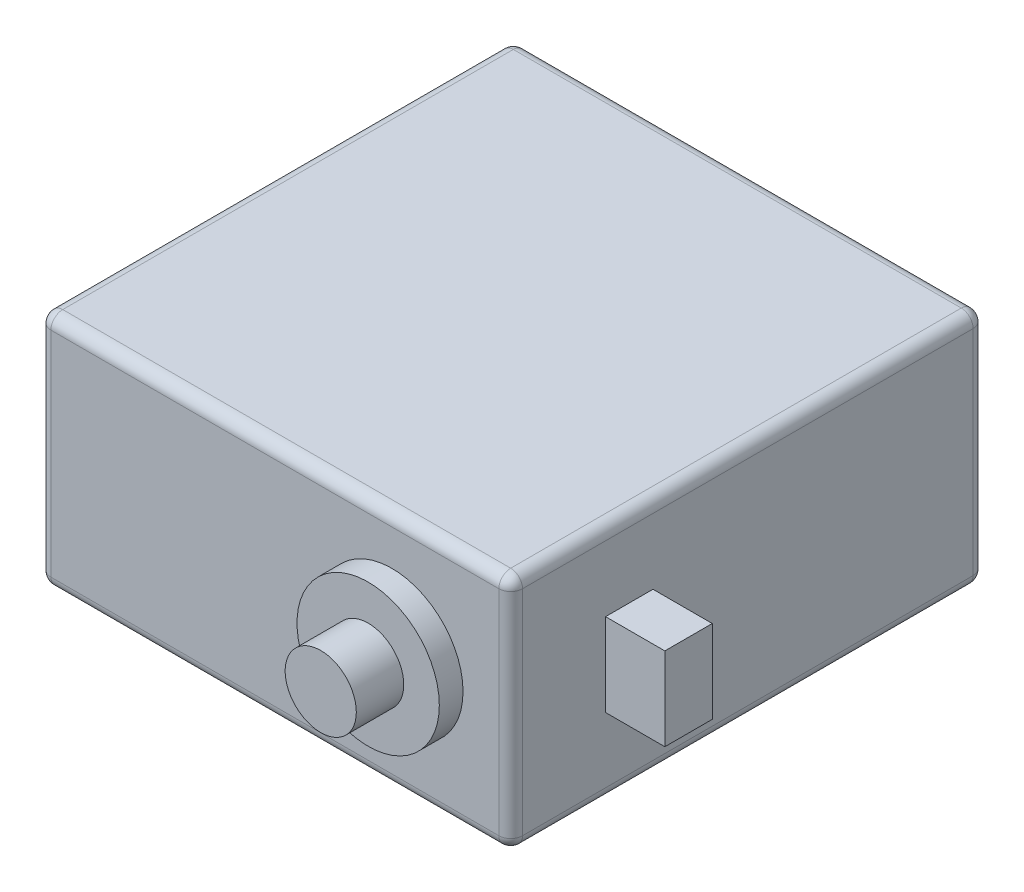
ISO-10303-21;
HEADER;
FILE_DESCRIPTION(('STEP AP214'),'2;1');
FILE_NAME('part.step','',(''),(''),'','','');
FILE_SCHEMA(('AUTOMOTIVE_DESIGN { 1 0 10303 214 1 1 1 1 }'));
ENDSEC;
DATA;
#1=APPLICATION_CONTEXT('core data for automotive mechanical design processes');
#2=APPLICATION_PROTOCOL_DEFINITION('international standard','automotive_design',2000,#1);
#3=PRODUCT_CONTEXT('',#1,'mechanical');
#4=PRODUCT('Part','Part','',(#3));
#5=PRODUCT_RELATED_PRODUCT_CATEGORY('part','',(#4));
#6=PRODUCT_DEFINITION_FORMATION('','',#4);
#7=PRODUCT_DEFINITION_CONTEXT('part definition',#1,'design');
#8=PRODUCT_DEFINITION('design','',#6,#7);
#9=PRODUCT_DEFINITION_SHAPE('','',#8);
#10=(LENGTH_UNIT() NAMED_UNIT(*) SI_UNIT(.MILLI.,.METRE.));
#11=(NAMED_UNIT(*) PLANE_ANGLE_UNIT() SI_UNIT($,.RADIAN.));
#12=(NAMED_UNIT(*) SI_UNIT($,.STERADIAN.) SOLID_ANGLE_UNIT());
#13=UNCERTAINTY_MEASURE_WITH_UNIT(LENGTH_MEASURE(1.E-05),#10,'distance_accuracy_value','');
#14=(GEOMETRIC_REPRESENTATION_CONTEXT(3) GLOBAL_UNCERTAINTY_ASSIGNED_CONTEXT((#13)) GLOBAL_UNIT_ASSIGNED_CONTEXT((#10,
#11,#12)) REPRESENTATION_CONTEXT('',''));
#15=CARTESIAN_POINT('',(0.,0.,0.));
#16=DIRECTION('',(0.,0.,1.));
#17=DIRECTION('',(1.,0.,0.));
#18=AXIS2_PLACEMENT_3D('',#15,#16,#17);
#19=CARTESIAN_POINT('',(19.89,20.04,20.));
#20=DIRECTION('',(-1.,0.,0.));
#21=DIRECTION('',(0.,0.,-1.));
#22=AXIS2_PLACEMENT_3D('',#19,#20,#21);
#23=PLANE('',#22);
#24=DIRECTION('',(0.,0.,1.));
#25=VECTOR('',#24,1.);
#26=CARTESIAN_POINT('',(19.89,19.04,20.));
#27=LINE('',#26,#25);
#28=CARTESIAN_POINT('',(19.89,19.04,19.));
#29=VERTEX_POINT('',#28);
#30=CARTESIAN_POINT('',(19.89,19.04,-19.));
#31=VERTEX_POINT('',#30);
#32=EDGE_CURVE('E50',#29,#31,#27,.F.);
#33=ORIENTED_EDGE('',*,*,#32,.F.);
#34=DIRECTION('',(0.,-1.,0.));
#35=VECTOR('',#34,1.);
#36=CARTESIAN_POINT('',(19.89,20.04,19.));
#37=LINE('',#36,#35);
#38=CARTESIAN_POINT('',(19.89,1.,19.));
#39=VERTEX_POINT('',#38);
#40=EDGE_CURVE('E270',#39,#29,#37,.F.);
#41=ORIENTED_EDGE('',*,*,#40,.F.);
#42=DIRECTION('',(0.,0.,1.));
#43=VECTOR('',#42,1.);
#44=CARTESIAN_POINT('',(19.89,1.,20.));
#45=LINE('',#44,#43);
#46=CARTESIAN_POINT('',(19.89,1.,-19.));
#47=VERTEX_POINT('',#46);
#48=EDGE_CURVE('E267',#47,#39,#45,.T.);
#49=ORIENTED_EDGE('',*,*,#48,.F.);
#50=DIRECTION('',(0.,-1.,0.));
#51=VECTOR('',#50,1.);
#52=CARTESIAN_POINT('',(19.89,20.04,-19.));
#53=LINE('',#52,#51);
#54=EDGE_CURVE('E11',#31,#47,#53,.T.);
#55=ORIENTED_EDGE('',*,*,#54,.F.);
#56=EDGE_LOOP('',(#33,#41,#49,#55));
#57=FACE_BOUND('',#56,.T.);
#58=DIRECTION('',(0.,-1.,0.));
#59=VECTOR('',#58,1.);
#60=CARTESIAN_POINT('',(19.89,13.5,8.));
#61=LINE('',#60,#59);
#62=CARTESIAN_POINT('',(19.89,13.5,8.));
#63=VERTEX_POINT('',#62);
#64=CARTESIAN_POINT('',(19.89,6.5,8.));
#65=VERTEX_POINT('',#64);
#66=EDGE_CURVE('E185',#63,#65,#61,.T.);
#67=ORIENTED_EDGE('',*,*,#66,.T.);
#68=DIRECTION('',(0.,0.,1.));
#69=VECTOR('',#68,1.);
#70=CARTESIAN_POINT('',(19.89,6.5,12.));
#71=LINE('',#70,#69);
#72=CARTESIAN_POINT('',(19.89,6.5,12.));
#73=VERTEX_POINT('',#72);
#74=EDGE_CURVE('E167',#65,#73,#71,.T.);
#75=ORIENTED_EDGE('',*,*,#74,.T.);
#76=DIRECTION('',(0.,1.,0.));
#77=VECTOR('',#76,1.);
#78=CARTESIAN_POINT('',(19.89,13.5,12.));
#79=LINE('',#78,#77);
#80=CARTESIAN_POINT('',(19.89,13.5,12.));
#81=VERTEX_POINT('',#80);
#82=EDGE_CURVE('E176',#73,#81,#79,.T.);
#83=ORIENTED_EDGE('',*,*,#82,.T.);
#84=DIRECTION('',(0.,0.,-1.));
#85=VECTOR('',#84,1.);
#86=CARTESIAN_POINT('',(19.89,13.5,12.));
#87=LINE('',#86,#85);
#88=EDGE_CURVE('E173',#81,#63,#87,.T.);
#89=ORIENTED_EDGE('',*,*,#88,.T.);
#90=EDGE_LOOP('',(#67,#75,#83,#89));
#91=FACE_BOUND('',#90,.T.);
#92=ADVANCED_FACE('F41',(#57,#91),#23,.F.);
#93=CARTESIAN_POINT('',(-19.89,20.04,20.));
#94=DIRECTION('',(1.,0.,0.));
#95=DIRECTION('',(0.,0.,1.));
#96=AXIS2_PLACEMENT_3D('',#93,#94,#95);
#97=PLANE('',#96);
#98=DIRECTION('',(0.,-1.,0.));
#99=VECTOR('',#98,1.);
#100=CARTESIAN_POINT('',(-19.89,20.04,-19.));
#101=LINE('',#100,#99);
#102=CARTESIAN_POINT('',(-19.89,1.,-19.));
#103=VERTEX_POINT('',#102);
#104=CARTESIAN_POINT('',(-19.89,19.04,-19.));
#105=VERTEX_POINT('',#104);
#106=EDGE_CURVE('E210',#103,#105,#101,.F.);
#107=ORIENTED_EDGE('',*,*,#106,.F.);
#108=DIRECTION('',(0.,0.,-1.));
#109=VECTOR('',#108,1.);
#110=CARTESIAN_POINT('',(-19.89,1.,-20.));
#111=LINE('',#110,#109);
#112=CARTESIAN_POINT('',(-19.89,1.,19.));
#113=VERTEX_POINT('',#112);
#114=EDGE_CURVE('E202',#113,#103,#111,.T.);
#115=ORIENTED_EDGE('',*,*,#114,.F.);
#116=DIRECTION('',(0.,-1.,0.));
#117=VECTOR('',#116,1.);
#118=CARTESIAN_POINT('',(-19.89,20.04,19.));
#119=LINE('',#118,#117);
#120=CARTESIAN_POINT('',(-19.89,19.04,19.));
#121=VERTEX_POINT('',#120);
#122=EDGE_CURVE('E213',#121,#113,#119,.T.);
#123=ORIENTED_EDGE('',*,*,#122,.F.);
#124=DIRECTION('',(0.,0.,-1.));
#125=VECTOR('',#124,1.);
#126=CARTESIAN_POINT('',(-19.89,19.04,20.));
#127=LINE('',#126,#125);
#128=EDGE_CURVE('E216',#105,#121,#127,.F.);
#129=ORIENTED_EDGE('',*,*,#128,.F.);
#130=EDGE_LOOP('',(#107,#115,#123,#129));
#131=FACE_BOUND('',#130,.T.);
#132=ADVANCED_FACE('F383',(#131),#97,.F.);
#133=CARTESIAN_POINT('',(19.89,20.04,-20.));
#134=DIRECTION('',(0.,0.,1.));
#135=DIRECTION('',(-1.,0.,0.));
#136=AXIS2_PLACEMENT_3D('',#133,#134,#135);
#137=PLANE('',#136);
#138=DIRECTION('',(1.,0.,0.));
#139=VECTOR('',#138,1.);
#140=CARTESIAN_POINT('',(19.89,19.04,-20.));
#141=LINE('',#140,#139);
#142=CARTESIAN_POINT('',(18.89,19.04,-20.));
#143=VERTEX_POINT('',#142);
#144=CARTESIAN_POINT('',(-18.89,19.04,-20.));
#145=VERTEX_POINT('',#144);
#146=EDGE_CURVE('E237',#143,#145,#141,.F.);
#147=ORIENTED_EDGE('',*,*,#146,.F.);
#148=DIRECTION('',(0.,-1.,0.));
#149=VECTOR('',#148,1.);
#150=CARTESIAN_POINT('',(18.89,20.04,-20.));
#151=LINE('',#150,#149);
#152=CARTESIAN_POINT('',(18.89,1.,-20.));
#153=VERTEX_POINT('',#152);
#154=EDGE_CURVE('E231',#153,#143,#151,.F.);
#155=ORIENTED_EDGE('',*,*,#154,.F.);
#156=DIRECTION('',(1.,0.,0.));
#157=VECTOR('',#156,1.);
#158=CARTESIAN_POINT('',(19.89,1.,-20.));
#159=LINE('',#158,#157);
#160=CARTESIAN_POINT('',(-18.89,1.,-20.));
#161=VERTEX_POINT('',#160);
#162=EDGE_CURVE('E234',#161,#153,#159,.T.);
#163=ORIENTED_EDGE('',*,*,#162,.F.);
#164=DIRECTION('',(0.,-1.,0.));
#165=VECTOR('',#164,1.);
#166=CARTESIAN_POINT('',(-18.89,20.04,-20.));
#167=LINE('',#166,#165);
#168=EDGE_CURVE('E240',#145,#161,#167,.T.);
#169=ORIENTED_EDGE('',*,*,#168,.F.);
#170=EDGE_LOOP('',(#147,#155,#163,#169));
#171=FACE_BOUND('',#170,.T.);
#172=CARTESIAN_POINT('',(9.87,10.02,-20.));
#173=DIRECTION('',(0.,0.,-1.));
#174=DIRECTION('',(-1.,0.,0.));
#175=AXIS2_PLACEMENT_3D('',#172,#173,#174);
#176=CIRCLE('',#175,6.);
#177=CARTESIAN_POINT('',(3.87,10.02,-20.));
#178=VERTEX_POINT('',#177);
#179=EDGE_CURVE('E203',#178,#178,#176,.F.);
#180=ORIENTED_EDGE('',*,*,#179,.T.);
#181=EDGE_LOOP('',(#180));
#182=FACE_BOUND('',#181,.T.);
#183=ADVANCED_FACE('F368',(#171,#182),#137,.F.);
#184=CARTESIAN_POINT('',(19.89,20.04,20.));
#185=DIRECTION('',(0.,0.,-1.));
#186=DIRECTION('',(1.,0.,0.));
#187=AXIS2_PLACEMENT_3D('',#184,#185,#186);
#188=PLANE('',#187);
#189=CARTESIAN_POINT('',(9.87,10.02,20.));
#190=DIRECTION('',(0.,0.,1.));
#191=DIRECTION('',(1.,0.,0.));
#192=AXIS2_PLACEMENT_3D('',#189,#190,#191);
#193=CIRCLE('',#192,6.);
#194=CARTESIAN_POINT('',(15.87,10.02,20.));
#195=VERTEX_POINT('',#194);
#196=EDGE_CURVE('E179',#195,#195,#193,.T.);
#197=ORIENTED_EDGE('',*,*,#196,.F.);
#198=EDGE_LOOP('',(#197));
#199=FACE_BOUND('',#198,.T.);
#200=DIRECTION('',(-1.,0.,0.));
#201=VECTOR('',#200,1.);
#202=CARTESIAN_POINT('',(-19.89,1.,20.));
#203=LINE('',#202,#201);
#204=CARTESIAN_POINT('',(18.89,1.,20.));
#205=VERTEX_POINT('',#204);
#206=CARTESIAN_POINT('',(-18.89,1.,20.));
#207=VERTEX_POINT('',#206);
#208=EDGE_CURVE('E222',#205,#207,#203,.T.);
#209=ORIENTED_EDGE('',*,*,#208,.F.);
#210=DIRECTION('',(0.,-1.,0.));
#211=VECTOR('',#210,1.);
#212=CARTESIAN_POINT('',(18.89,20.04,20.));
#213=LINE('',#212,#211);
#214=CARTESIAN_POINT('',(18.89,19.04,20.));
#215=VERTEX_POINT('',#214);
#216=EDGE_CURVE('E219',#215,#205,#213,.T.);
#217=ORIENTED_EDGE('',*,*,#216,.F.);
#218=DIRECTION('',(-1.,0.,0.));
#219=VECTOR('',#218,1.);
#220=CARTESIAN_POINT('',(19.89,19.04,20.));
#221=LINE('',#220,#219);
#222=CARTESIAN_POINT('',(-18.89,19.04,20.));
#223=VERTEX_POINT('',#222);
#224=EDGE_CURVE('E225',#223,#215,#221,.F.);
#225=ORIENTED_EDGE('',*,*,#224,.F.);
#226=DIRECTION('',(0.,-1.,0.));
#227=VECTOR('',#226,1.);
#228=CARTESIAN_POINT('',(-18.89,20.04,20.));
#229=LINE('',#228,#227);
#230=EDGE_CURVE('E228',#207,#223,#229,.F.);
#231=ORIENTED_EDGE('',*,*,#230,.F.);
#232=EDGE_LOOP('',(#209,#217,#225,#231));
#233=FACE_BOUND('',#232,.T.);
#234=ADVANCED_FACE('F392',(#199,#233),#188,.F.);
#235=CARTESIAN_POINT('',(0.,20.04,0.));
#236=DIRECTION('',(0.,-1.,0.));
#237=DIRECTION('',(0.,0.,1.));
#238=AXIS2_PLACEMENT_3D('',#235,#236,#237);
#239=PLANE('',#238);
#240=DIRECTION('',(-1.,0.,0.));
#241=VECTOR('',#240,1.);
#242=CARTESIAN_POINT('',(0.,20.04,19.));
#243=LINE('',#242,#241);
#244=CARTESIAN_POINT('',(18.89,20.04,19.));
#245=VERTEX_POINT('',#244);
#246=CARTESIAN_POINT('',(-18.89,20.04,19.));
#247=VERTEX_POINT('',#246);
#248=EDGE_CURVE('E249',#245,#247,#243,.T.);
#249=ORIENTED_EDGE('',*,*,#248,.F.);
#250=DIRECTION('',(0.,0.,1.));
#251=VECTOR('',#250,1.);
#252=CARTESIAN_POINT('',(18.89,20.04,0.));
#253=LINE('',#252,#251);
#254=CARTESIAN_POINT('',(18.89,20.04,-19.));
#255=VERTEX_POINT('',#254);
#256=EDGE_CURVE('E243',#255,#245,#253,.T.);
#257=ORIENTED_EDGE('',*,*,#256,.F.);
#258=DIRECTION('',(1.,0.,0.));
#259=VECTOR('',#258,1.);
#260=CARTESIAN_POINT('',(0.,20.04,-19.));
#261=LINE('',#260,#259);
#262=CARTESIAN_POINT('',(-18.89,20.04,-19.));
#263=VERTEX_POINT('',#262);
#264=EDGE_CURVE('E246',#263,#255,#261,.T.);
#265=ORIENTED_EDGE('',*,*,#264,.F.);
#266=DIRECTION('',(0.,0.,-1.));
#267=VECTOR('',#266,1.);
#268=CARTESIAN_POINT('',(-18.89,20.04,0.));
#269=LINE('',#268,#267);
#270=EDGE_CURVE('E252',#247,#263,#269,.T.);
#271=ORIENTED_EDGE('',*,*,#270,.F.);
#272=EDGE_LOOP('',(#249,#257,#265,#271));
#273=FACE_BOUND('',#272,.T.);
#274=ADVANCED_FACE('F653',(#273),#239,.F.);
#275=CARTESIAN_POINT('',(0.,0.,0.));
#276=DIRECTION('',(0.,-1.,0.));
#277=DIRECTION('',(0.,0.,1.));
#278=AXIS2_PLACEMENT_3D('',#275,#276,#277);
#279=PLANE('',#278);
#280=DIRECTION('',(1.,0.,0.));
#281=VECTOR('',#280,1.);
#282=CARTESIAN_POINT('',(-19.89,0.,-19.));
#283=LINE('',#282,#281);
#284=CARTESIAN_POINT('',(18.89,0.,-19.));
#285=VERTEX_POINT('',#284);
#286=CARTESIAN_POINT('',(-18.89,0.,-19.));
#287=VERTEX_POINT('',#286);
#288=EDGE_CURVE('E261',#285,#287,#283,.F.);
#289=ORIENTED_EDGE('',*,*,#288,.F.);
#290=DIRECTION('',(0.,0.,1.));
#291=VECTOR('',#290,1.);
#292=CARTESIAN_POINT('',(18.89,0.,-20.));
#293=LINE('',#292,#291);
#294=CARTESIAN_POINT('',(18.89,0.,19.));
#295=VERTEX_POINT('',#294);
#296=EDGE_CURVE('E255',#295,#285,#293,.F.);
#297=ORIENTED_EDGE('',*,*,#296,.F.);
#298=DIRECTION('',(-1.,0.,0.));
#299=VECTOR('',#298,1.);
#300=CARTESIAN_POINT('',(19.89,0.,19.));
#301=LINE('',#300,#299);
#302=CARTESIAN_POINT('',(-18.89,0.,19.));
#303=VERTEX_POINT('',#302);
#304=EDGE_CURVE('E258',#303,#295,#301,.F.);
#305=ORIENTED_EDGE('',*,*,#304,.F.);
#306=DIRECTION('',(0.,0.,-1.));
#307=VECTOR('',#306,1.);
#308=CARTESIAN_POINT('',(-18.89,0.,20.));
#309=LINE('',#308,#307);
#310=EDGE_CURVE('E264',#287,#303,#309,.F.);
#311=ORIENTED_EDGE('',*,*,#310,.F.);
#312=EDGE_LOOP('',(#289,#297,#305,#311));
#313=FACE_BOUND('',#312,.T.);
#314=ADVANCED_FACE('F647',(#313),#279,.T.);
#315=CARTESIAN_POINT('',(9.87,10.02,-22.));
#316=DIRECTION('',(0.,0.,1.));
#317=DIRECTION('',(-1.,0.,0.));
#318=AXIS2_PLACEMENT_3D('',#315,#316,#317);
#319=CYLINDRICAL_SURFACE('',#318,6.);
#320=CARTESIAN_POINT('',(9.87,10.02,-22.));
#321=DIRECTION('',(0.,0.,1.));
#322=DIRECTION('',(1.,0.,0.));
#323=AXIS2_PLACEMENT_3D('',#320,#321,#322);
#324=CIRCLE('',#323,6.);
#325=CARTESIAN_POINT('',(15.87,10.02,-22.));
#326=VERTEX_POINT('',#325);
#327=EDGE_CURVE('E198',#326,#326,#324,.T.);
#328=ORIENTED_EDGE('',*,*,#327,.T.);
#329=EDGE_LOOP('',(#328));
#330=FACE_BOUND('',#329,.T.);
#331=ORIENTED_EDGE('',*,*,#179,.F.);
#332=EDGE_LOOP('',(#331));
#333=FACE_BOUND('',#332,.T.);
#334=ADVANCED_FACE('F638',(#330,#333),#319,.T.);
#335=CARTESIAN_POINT('',(9.87,10.02,-22.));
#336=DIRECTION('',(0.,0.,-1.));
#337=DIRECTION('',(1.,0.,0.));
#338=AXIS2_PLACEMENT_3D('',#335,#336,#337);
#339=PLANE('',#338);
#340=CARTESIAN_POINT('',(9.87,10.02,-22.));
#341=DIRECTION('',(0.,0.,1.));
#342=DIRECTION('',(1.,0.,0.));
#343=AXIS2_PLACEMENT_3D('',#340,#341,#342);
#344=CIRCLE('',#343,3.);
#345=CARTESIAN_POINT('',(12.87,10.02,-22.));
#346=VERTEX_POINT('',#345);
#347=EDGE_CURVE('E199',#346,#346,#344,.T.);
#348=ORIENTED_EDGE('',*,*,#347,.T.);
#349=EDGE_LOOP('',(#348));
#350=FACE_BOUND('',#349,.T.);
#351=ORIENTED_EDGE('',*,*,#327,.F.);
#352=EDGE_LOOP('',(#351));
#353=FACE_BOUND('',#352,.T.);
#354=ADVANCED_FACE('F629',(#350,#353),#339,.T.);
#355=CARTESIAN_POINT('',(9.87,10.02,-26.));
#356=DIRECTION('',(0.,0.,1.));
#357=DIRECTION('',(-1.,0.,0.));
#358=AXIS2_PLACEMENT_3D('',#355,#356,#357);
#359=CYLINDRICAL_SURFACE('',#358,3.);
#360=CARTESIAN_POINT('',(9.87,10.02,-26.));
#361=DIRECTION('',(0.,0.,1.));
#362=DIRECTION('',(1.,0.,0.));
#363=AXIS2_PLACEMENT_3D('',#360,#361,#362);
#364=CIRCLE('',#363,3.);
#365=CARTESIAN_POINT('',(12.87,10.02,-26.));
#366=VERTEX_POINT('',#365);
#367=EDGE_CURVE('E195',#366,#366,#364,.T.);
#368=ORIENTED_EDGE('',*,*,#367,.T.);
#369=EDGE_LOOP('',(#368));
#370=FACE_BOUND('',#369,.T.);
#371=ORIENTED_EDGE('',*,*,#347,.F.);
#372=EDGE_LOOP('',(#371));
#373=FACE_BOUND('',#372,.T.);
#374=ADVANCED_FACE('F619',(#370,#373),#359,.T.);
#375=CARTESIAN_POINT('',(9.87,10.02,-26.));
#376=DIRECTION('',(0.,0.,-1.));
#377=DIRECTION('',(1.,0.,0.));
#378=AXIS2_PLACEMENT_3D('',#375,#376,#377);
#379=PLANE('',#378);
#380=ORIENTED_EDGE('',*,*,#367,.F.);
#381=EDGE_LOOP('',(#380));
#382=FACE_BOUND('',#381,.T.);
#383=ADVANCED_FACE('F381',(#382),#379,.T.);
#384=CARTESIAN_POINT('',(18.89,20.04,-19.));
#385=DIRECTION('',(0.,-1.,0.));
#386=DIRECTION('',(0.,0.,1.));
#387=AXIS2_PLACEMENT_3D('',#384,#385,#386);
#388=CYLINDRICAL_SURFACE('',#387,1.);
#389=CARTESIAN_POINT('',(18.89,19.04,-19.));
#390=DIRECTION('',(0.,-1.,0.));
#391=DIRECTION('',(0.,0.,-1.));
#392=AXIS2_PLACEMENT_3D('',#389,#390,#391);
#393=CIRCLE('',#392,1.);
#394=EDGE_CURVE('E45',#143,#31,#393,.T.);
#395=ORIENTED_EDGE('',*,*,#394,.T.);
#396=ORIENTED_EDGE('',*,*,#54,.T.);
#397=CARTESIAN_POINT('',(18.89,1.,-19.));
#398=DIRECTION('',(0.,1.,0.));
#399=DIRECTION('',(0.,0.,1.));
#400=AXIS2_PLACEMENT_3D('',#397,#398,#399);
#401=CIRCLE('',#400,1.);
#402=EDGE_CURVE('E326',#47,#153,#401,.T.);
#403=ORIENTED_EDGE('',*,*,#402,.T.);
#404=ORIENTED_EDGE('',*,*,#154,.T.);
#405=EDGE_LOOP('',(#395,#396,#403,#404));
#406=FACE_BOUND('',#405,.T.);
#407=ADVANCED_FACE('F43',(#406),#388,.T.);
#408=CARTESIAN_POINT('',(18.89,19.04,-19.));
#409=DIRECTION('',(1.,0.,0.));
#410=DIRECTION('',(0.,0.,1.));
#411=AXIS2_PLACEMENT_3D('',#408,#409,#410);
#412=SPHERICAL_SURFACE('',#411,1.);
#413=CARTESIAN_POINT('',(18.89,19.04,-19.));
#414=DIRECTION('',(-1.,0.,0.));
#415=DIRECTION('',(0.,0.,1.));
#416=AXIS2_PLACEMENT_3D('',#413,#414,#415);
#417=CIRCLE('',#416,1.);
#418=EDGE_CURVE('E322',#143,#255,#417,.F.);
#419=ORIENTED_EDGE('',*,*,#418,.T.);
#420=CARTESIAN_POINT('',(18.89,19.04,-19.));
#421=DIRECTION('',(0.,0.,1.));
#422=DIRECTION('',(0.,-1.,0.));
#423=AXIS2_PLACEMENT_3D('',#420,#421,#422);
#424=CIRCLE('',#423,1.);
#425=EDGE_CURVE('E325',#255,#31,#424,.F.);
#426=ORIENTED_EDGE('',*,*,#425,.T.);
#427=ORIENTED_EDGE('',*,*,#394,.F.);
#428=EDGE_LOOP('',(#419,#426,#427));
#429=FACE_BOUND('',#428,.T.);
#430=ADVANCED_FACE('F374',(#429),#412,.T.);
#431=CARTESIAN_POINT('',(18.89,1.,-19.));
#432=DIRECTION('',(0.,0.,-1.));
#433=DIRECTION('',(0.,-1.,0.));
#434=AXIS2_PLACEMENT_3D('',#431,#432,#433);
#435=SPHERICAL_SURFACE('',#434,1.);
#436=CARTESIAN_POINT('',(18.89,1.,-19.));
#437=DIRECTION('',(0.,0.,1.));
#438=DIRECTION('',(1.,0.,0.));
#439=AXIS2_PLACEMENT_3D('',#436,#437,#438);
#440=CIRCLE('',#439,1.);
#441=EDGE_CURVE('E317',#47,#285,#440,.F.);
#442=ORIENTED_EDGE('',*,*,#441,.T.);
#443=CARTESIAN_POINT('',(18.89,1.,-19.));
#444=DIRECTION('',(-1.,0.,0.));
#445=DIRECTION('',(0.,0.,1.));
#446=AXIS2_PLACEMENT_3D('',#443,#444,#445);
#447=CIRCLE('',#446,1.);
#448=EDGE_CURVE('E320',#285,#153,#447,.F.);
#449=ORIENTED_EDGE('',*,*,#448,.T.);
#450=ORIENTED_EDGE('',*,*,#402,.F.);
#451=EDGE_LOOP('',(#442,#449,#450));
#452=FACE_BOUND('',#451,.T.);
#453=ADVANCED_FACE('F360',(#452),#435,.T.);
#454=CARTESIAN_POINT('',(18.89,19.04,0.));
#455=DIRECTION('',(0.,0.,1.));
#456=DIRECTION('',(-1.,0.,0.));
#457=AXIS2_PLACEMENT_3D('',#454,#455,#456);
#458=CYLINDRICAL_SURFACE('',#457,1.);
#459=ORIENTED_EDGE('',*,*,#425,.F.);
#460=ORIENTED_EDGE('',*,*,#256,.T.);
#461=CARTESIAN_POINT('',(18.89,19.04,19.));
#462=DIRECTION('',(0.,0.,-1.));
#463=DIRECTION('',(-1.,0.,0.));
#464=AXIS2_PLACEMENT_3D('',#461,#462,#463);
#465=CIRCLE('',#464,1.);
#466=EDGE_CURVE('E311',#245,#29,#465,.T.);
#467=ORIENTED_EDGE('',*,*,#466,.T.);
#468=ORIENTED_EDGE('',*,*,#32,.T.);
#469=EDGE_LOOP('',(#459,#460,#467,#468));
#470=FACE_BOUND('',#469,.T.);
#471=ADVANCED_FACE('F342',(#470),#458,.T.);
#472=CARTESIAN_POINT('',(0.,19.04,-19.));
#473=DIRECTION('',(1.,0.,0.));
#474=DIRECTION('',(0.,0.,1.));
#475=AXIS2_PLACEMENT_3D('',#472,#473,#474);
#476=CYLINDRICAL_SURFACE('',#475,1.);
#477=ORIENTED_EDGE('',*,*,#418,.F.);
#478=ORIENTED_EDGE('',*,*,#146,.T.);
#479=CARTESIAN_POINT('',(-18.89,19.04,-19.));
#480=DIRECTION('',(1.,0.,0.));
#481=DIRECTION('',(0.,0.,-1.));
#482=AXIS2_PLACEMENT_3D('',#479,#480,#481);
#483=CIRCLE('',#482,1.);
#484=EDGE_CURVE('E308',#145,#263,#483,.T.);
#485=ORIENTED_EDGE('',*,*,#484,.T.);
#486=ORIENTED_EDGE('',*,*,#264,.T.);
#487=EDGE_LOOP('',(#477,#478,#485,#486));
#488=FACE_BOUND('',#487,.T.);
#489=ADVANCED_FACE('F371',(#488),#476,.T.);
#490=CARTESIAN_POINT('',(-18.89,20.04,-19.));
#491=DIRECTION('',(0.,-1.,0.));
#492=DIRECTION('',(0.,0.,1.));
#493=AXIS2_PLACEMENT_3D('',#490,#491,#492);
#494=CYLINDRICAL_SURFACE('',#493,1.);
#495=CARTESIAN_POINT('',(-18.89,1.,-19.));
#496=DIRECTION('',(0.,1.,0.));
#497=DIRECTION('',(0.,0.,1.));
#498=AXIS2_PLACEMENT_3D('',#495,#496,#497);
#499=CIRCLE('',#498,1.);
#500=EDGE_CURVE('E303',#161,#103,#499,.T.);
#501=ORIENTED_EDGE('',*,*,#500,.T.);
#502=ORIENTED_EDGE('',*,*,#106,.T.);
#503=CARTESIAN_POINT('',(-18.89,19.04,-19.));
#504=DIRECTION('',(0.,-1.,0.));
#505=DIRECTION('',(0.,0.,-1.));
#506=AXIS2_PLACEMENT_3D('',#503,#504,#505);
#507=CIRCLE('',#506,1.);
#508=EDGE_CURVE('E306',#105,#145,#507,.T.);
#509=ORIENTED_EDGE('',*,*,#508,.T.);
#510=ORIENTED_EDGE('',*,*,#168,.T.);
#511=EDGE_LOOP('',(#501,#502,#509,#510));
#512=FACE_BOUND('',#511,.T.);
#513=ADVANCED_FACE('F443',(#512),#494,.T.);
#514=CARTESIAN_POINT('',(19.89,1.,-19.));
#515=DIRECTION('',(-1.,0.,0.));
#516=DIRECTION('',(0.,0.,-1.));
#517=AXIS2_PLACEMENT_3D('',#514,#515,#516);
#518=CYLINDRICAL_SURFACE('',#517,1.);
#519=ORIENTED_EDGE('',*,*,#448,.F.);
#520=ORIENTED_EDGE('',*,*,#288,.T.);
#521=CARTESIAN_POINT('',(-18.89,1.,-19.));
#522=DIRECTION('',(1.,0.,0.));
#523=DIRECTION('',(0.,0.,-1.));
#524=AXIS2_PLACEMENT_3D('',#521,#522,#523);
#525=CIRCLE('',#524,1.);
#526=EDGE_CURVE('E301',#287,#161,#525,.T.);
#527=ORIENTED_EDGE('',*,*,#526,.T.);
#528=ORIENTED_EDGE('',*,*,#162,.T.);
#529=EDGE_LOOP('',(#519,#520,#527,#528));
#530=FACE_BOUND('',#529,.T.);
#531=ADVANCED_FACE('F362',(#530),#518,.T.);
#532=CARTESIAN_POINT('',(18.89,1.,20.));
#533=DIRECTION('',(0.,0.,-1.));
#534=DIRECTION('',(1.,0.,0.));
#535=AXIS2_PLACEMENT_3D('',#532,#533,#534);
#536=CYLINDRICAL_SURFACE('',#535,1.);
#537=ORIENTED_EDGE('',*,*,#441,.F.);
#538=ORIENTED_EDGE('',*,*,#48,.T.);
#539=CARTESIAN_POINT('',(18.89,1.,19.));
#540=DIRECTION('',(0.,0.,-1.));
#541=DIRECTION('',(-1.,0.,0.));
#542=AXIS2_PLACEMENT_3D('',#539,#540,#541);
#543=CIRCLE('',#542,1.);
#544=EDGE_CURVE('E298',#39,#295,#543,.T.);
#545=ORIENTED_EDGE('',*,*,#544,.T.);
#546=ORIENTED_EDGE('',*,*,#296,.T.);
#547=EDGE_LOOP('',(#537,#538,#545,#546));
#548=FACE_BOUND('',#547,.T.);
#549=ADVANCED_FACE('F356',(#548),#536,.T.);
#550=CARTESIAN_POINT('',(18.89,20.04,19.));
#551=DIRECTION('',(0.,-1.,0.));
#552=DIRECTION('',(0.,0.,1.));
#553=AXIS2_PLACEMENT_3D('',#550,#551,#552);
#554=CYLINDRICAL_SURFACE('',#553,1.);
#555=CARTESIAN_POINT('',(18.89,19.04,19.));
#556=DIRECTION('',(0.,-1.,0.));
#557=DIRECTION('',(0.,0.,-1.));
#558=AXIS2_PLACEMENT_3D('',#555,#556,#557);
#559=CIRCLE('',#558,1.);
#560=EDGE_CURVE('E314',#29,#215,#559,.T.);
#561=ORIENTED_EDGE('',*,*,#560,.T.);
#562=ORIENTED_EDGE('',*,*,#216,.T.);
#563=CARTESIAN_POINT('',(18.89,1.,19.));
#564=DIRECTION('',(0.,1.,0.));
#565=DIRECTION('',(0.,0.,1.));
#566=AXIS2_PLACEMENT_3D('',#563,#564,#565);
#567=CIRCLE('',#566,1.);
#568=EDGE_CURVE('E296',#205,#39,#567,.T.);
#569=ORIENTED_EDGE('',*,*,#568,.T.);
#570=ORIENTED_EDGE('',*,*,#40,.T.);
#571=EDGE_LOOP('',(#561,#562,#569,#570));
#572=FACE_BOUND('',#571,.T.);
#573=ADVANCED_FACE('F348',(#572),#554,.T.);
#574=CARTESIAN_POINT('',(18.89,19.04,19.));
#575=DIRECTION('',(1.,0.,0.));
#576=DIRECTION('',(0.,0.,1.));
#577=AXIS2_PLACEMENT_3D('',#574,#575,#576);
#578=SPHERICAL_SURFACE('',#577,1.);
#579=ORIENTED_EDGE('',*,*,#466,.F.);
#580=CARTESIAN_POINT('',(18.89,19.04,19.));
#581=DIRECTION('',(-1.,0.,0.));
#582=DIRECTION('',(0.,1.,0.));
#583=AXIS2_PLACEMENT_3D('',#580,#581,#582);
#584=CIRCLE('',#583,1.);
#585=EDGE_CURVE('E294',#245,#215,#584,.F.);
#586=ORIENTED_EDGE('',*,*,#585,.T.);
#587=ORIENTED_EDGE('',*,*,#560,.F.);
#588=EDGE_LOOP('',(#579,#586,#587));
#589=FACE_BOUND('',#588,.T.);
#590=ADVANCED_FACE('F433',(#589),#578,.T.);
#591=CARTESIAN_POINT('',(-18.89,19.04,-19.));
#592=DIRECTION('',(0.,0.,-1.));
#593=DIRECTION('',(1.,0.,0.));
#594=AXIS2_PLACEMENT_3D('',#591,#592,#593);
#595=SPHERICAL_SURFACE('',#594,1.);
#596=ORIENTED_EDGE('',*,*,#508,.F.);
#597=CARTESIAN_POINT('',(-18.89,19.04,-19.));
#598=DIRECTION('',(0.,0.,1.));
#599=DIRECTION('',(1.,0.,0.));
#600=AXIS2_PLACEMENT_3D('',#597,#598,#599);
#601=CIRCLE('',#600,1.);
#602=EDGE_CURVE('E292',#105,#263,#601,.F.);
#603=ORIENTED_EDGE('',*,*,#602,.T.);
#604=ORIENTED_EDGE('',*,*,#484,.F.);
#605=EDGE_LOOP('',(#596,#603,#604));
#606=FACE_BOUND('',#605,.T.);
#607=ADVANCED_FACE('F429',(#606),#595,.T.);
#608=CARTESIAN_POINT('',(-18.89,1.,-19.));
#609=DIRECTION('',(0.,0.,-1.));
#610=DIRECTION('',(0.,-1.,0.));
#611=AXIS2_PLACEMENT_3D('',#608,#609,#610);
#612=SPHERICAL_SURFACE('',#611,1.);
#613=ORIENTED_EDGE('',*,*,#526,.F.);
#614=CARTESIAN_POINT('',(-18.89,1.,-19.));
#615=DIRECTION('',(0.,0.,1.));
#616=DIRECTION('',(1.,0.,0.));
#617=AXIS2_PLACEMENT_3D('',#614,#615,#616);
#618=CIRCLE('',#617,1.);
#619=EDGE_CURVE('E290',#287,#103,#618,.F.);
#620=ORIENTED_EDGE('',*,*,#619,.T.);
#621=ORIENTED_EDGE('',*,*,#500,.F.);
#622=EDGE_LOOP('',(#613,#620,#621));
#623=FACE_BOUND('',#622,.T.);
#624=ADVANCED_FACE('F426',(#623),#612,.T.);
#625=CARTESIAN_POINT('',(18.89,1.,19.));
#626=DIRECTION('',(1.,0.,0.));
#627=DIRECTION('',(0.,1.,0.));
#628=AXIS2_PLACEMENT_3D('',#625,#626,#627);
#629=SPHERICAL_SURFACE('',#628,1.);
#630=ORIENTED_EDGE('',*,*,#568,.F.);
#631=CARTESIAN_POINT('',(18.89,1.,19.));
#632=DIRECTION('',(-1.,0.,0.));
#633=DIRECTION('',(0.,0.,1.));
#634=AXIS2_PLACEMENT_3D('',#631,#632,#633);
#635=CIRCLE('',#634,1.);
#636=EDGE_CURVE('E288',#205,#295,#635,.F.);
#637=ORIENTED_EDGE('',*,*,#636,.T.);
#638=ORIENTED_EDGE('',*,*,#544,.F.);
#639=EDGE_LOOP('',(#630,#637,#638));
#640=FACE_BOUND('',#639,.T.);
#641=ADVANCED_FACE('F354',(#640),#629,.T.);
#642=CARTESIAN_POINT('',(0.,19.04,19.));
#643=DIRECTION('',(-1.,0.,0.));
#644=DIRECTION('',(0.,0.,-1.));
#645=AXIS2_PLACEMENT_3D('',#642,#643,#644);
#646=CYLINDRICAL_SURFACE('',#645,1.);
#647=ORIENTED_EDGE('',*,*,#585,.F.);
#648=ORIENTED_EDGE('',*,*,#248,.T.);
#649=CARTESIAN_POINT('',(-18.89,19.04,19.));
#650=DIRECTION('',(1.,0.,0.));
#651=DIRECTION('',(0.,0.,-1.));
#652=AXIS2_PLACEMENT_3D('',#649,#650,#651);
#653=CIRCLE('',#652,1.);
#654=EDGE_CURVE('E285',#247,#223,#653,.T.);
#655=ORIENTED_EDGE('',*,*,#654,.T.);
#656=ORIENTED_EDGE('',*,*,#224,.T.);
#657=EDGE_LOOP('',(#647,#648,#655,#656));
#658=FACE_BOUND('',#657,.T.);
#659=ADVANCED_FACE('F419',(#658),#646,.T.);
#660=CARTESIAN_POINT('',(-18.89,19.04,0.));
#661=DIRECTION('',(0.,0.,-1.));
#662=DIRECTION('',(1.,0.,0.));
#663=AXIS2_PLACEMENT_3D('',#660,#661,#662);
#664=CYLINDRICAL_SURFACE('',#663,1.);
#665=ORIENTED_EDGE('',*,*,#602,.F.);
#666=ORIENTED_EDGE('',*,*,#128,.T.);
#667=CARTESIAN_POINT('',(-18.89,19.04,19.));
#668=DIRECTION('',(0.,0.,-1.));
#669=DIRECTION('',(-1.,0.,0.));
#670=AXIS2_PLACEMENT_3D('',#667,#668,#669);
#671=CIRCLE('',#670,1.);
#672=EDGE_CURVE('E283',#121,#247,#671,.T.);
#673=ORIENTED_EDGE('',*,*,#672,.T.);
#674=ORIENTED_EDGE('',*,*,#270,.T.);
#675=EDGE_LOOP('',(#665,#666,#673,#674));
#676=FACE_BOUND('',#675,.T.);
#677=ADVANCED_FACE('F415',(#676),#664,.T.);
#678=CARTESIAN_POINT('',(-18.89,1.,20.));
#679=DIRECTION('',(0.,0.,1.));
#680=DIRECTION('',(-1.,0.,0.));
#681=AXIS2_PLACEMENT_3D('',#678,#679,#680);
#682=CYLINDRICAL_SURFACE('',#681,1.);
#683=ORIENTED_EDGE('',*,*,#619,.F.);
#684=ORIENTED_EDGE('',*,*,#310,.T.);
#685=CARTESIAN_POINT('',(-18.89,1.,19.));
#686=DIRECTION('',(0.,0.,-1.));
#687=DIRECTION('',(-1.,0.,0.));
#688=AXIS2_PLACEMENT_3D('',#685,#686,#687);
#689=CIRCLE('',#688,1.);
#690=EDGE_CURVE('E280',#303,#113,#689,.T.);
#691=ORIENTED_EDGE('',*,*,#690,.T.);
#692=ORIENTED_EDGE('',*,*,#114,.T.);
#693=EDGE_LOOP('',(#683,#684,#691,#692));
#694=FACE_BOUND('',#693,.T.);
#695=ADVANCED_FACE('F411',(#694),#682,.T.);
#696=CARTESIAN_POINT('',(19.89,1.,19.));
#697=DIRECTION('',(1.,0.,0.));
#698=DIRECTION('',(0.,0.,1.));
#699=AXIS2_PLACEMENT_3D('',#696,#697,#698);
#700=CYLINDRICAL_SURFACE('',#699,1.);
#701=ORIENTED_EDGE('',*,*,#636,.F.);
#702=ORIENTED_EDGE('',*,*,#208,.T.);
#703=CARTESIAN_POINT('',(-18.89,1.,19.));
#704=DIRECTION('',(1.,0.,0.));
#705=DIRECTION('',(0.,0.,-1.));
#706=AXIS2_PLACEMENT_3D('',#703,#704,#705);
#707=CIRCLE('',#706,1.);
#708=EDGE_CURVE('E278',#207,#303,#707,.T.);
#709=ORIENTED_EDGE('',*,*,#708,.T.);
#710=ORIENTED_EDGE('',*,*,#304,.T.);
#711=EDGE_LOOP('',(#701,#702,#709,#710));
#712=FACE_BOUND('',#711,.T.);
#713=ADVANCED_FACE('F407',(#712),#700,.T.);
#714=CARTESIAN_POINT('',(-18.89,19.04,19.));
#715=DIRECTION('',(0.,1.,0.));
#716=DIRECTION('',(0.,0.,-1.));
#717=AXIS2_PLACEMENT_3D('',#714,#715,#716);
#718=SPHERICAL_SURFACE('',#717,1.);
#719=ORIENTED_EDGE('',*,*,#672,.F.);
#720=CARTESIAN_POINT('',(-18.89,19.04,19.));
#721=DIRECTION('',(0.,-1.,0.));
#722=DIRECTION('',(0.,0.,-1.));
#723=AXIS2_PLACEMENT_3D('',#720,#721,#722);
#724=CIRCLE('',#723,1.);
#725=EDGE_CURVE('E276',#121,#223,#724,.F.);
#726=ORIENTED_EDGE('',*,*,#725,.T.);
#727=ORIENTED_EDGE('',*,*,#654,.F.);
#728=EDGE_LOOP('',(#719,#726,#727));
#729=FACE_BOUND('',#728,.T.);
#730=ADVANCED_FACE('F403',(#729),#718,.T.);
#731=CARTESIAN_POINT('',(-18.89,1.,19.));
#732=DIRECTION('',(0.,-1.,0.));
#733=DIRECTION('',(0.,0.,1.));
#734=AXIS2_PLACEMENT_3D('',#731,#732,#733);
#735=SPHERICAL_SURFACE('',#734,1.);
#736=ORIENTED_EDGE('',*,*,#708,.F.);
#737=CARTESIAN_POINT('',(-18.89,1.,19.));
#738=DIRECTION('',(0.,1.,0.));
#739=DIRECTION('',(0.,0.,1.));
#740=AXIS2_PLACEMENT_3D('',#737,#738,#739);
#741=CIRCLE('',#740,1.);
#742=EDGE_CURVE('E169',#207,#113,#741,.F.);
#743=ORIENTED_EDGE('',*,*,#742,.T.);
#744=ORIENTED_EDGE('',*,*,#690,.F.);
#745=EDGE_LOOP('',(#736,#743,#744));
#746=FACE_BOUND('',#745,.T.);
#747=ADVANCED_FACE('F399',(#746),#735,.T.);
#748=CARTESIAN_POINT('',(-18.89,20.04,19.));
#749=DIRECTION('',(0.,-1.,0.));
#750=DIRECTION('',(0.,0.,1.));
#751=AXIS2_PLACEMENT_3D('',#748,#749,#750);
#752=CYLINDRICAL_SURFACE('',#751,1.);
#753=ORIENTED_EDGE('',*,*,#725,.F.);
#754=ORIENTED_EDGE('',*,*,#122,.T.);
#755=ORIENTED_EDGE('',*,*,#742,.F.);
#756=ORIENTED_EDGE('',*,*,#230,.T.);
#757=EDGE_LOOP('',(#753,#754,#755,#756));
#758=FACE_BOUND('',#757,.T.);
#759=ADVANCED_FACE('F396',(#758),#752,.T.);
#760=CARTESIAN_POINT('',(24.89,13.5,8.));
#761=DIRECTION('',(0.,0.,1.));
#762=DIRECTION('',(0.,1.,0.));
#763=AXIS2_PLACEMENT_3D('',#760,#761,#762);
#764=PLANE('',#763);
#765=ORIENTED_EDGE('',*,*,#66,.F.);
#766=DIRECTION('',(-1.,0.,0.));
#767=VECTOR('',#766,1.);
#768=CARTESIAN_POINT('',(24.89,13.5,8.));
#769=LINE('',#768,#767);
#770=CARTESIAN_POINT('',(24.89,13.5,8.));
#771=VERTEX_POINT('',#770);
#772=EDGE_CURVE('E172',#771,#63,#769,.T.);
#773=ORIENTED_EDGE('',*,*,#772,.F.);
#774=DIRECTION('',(0.,-1.,0.));
#775=VECTOR('',#774,1.);
#776=CARTESIAN_POINT('',(24.89,13.5,8.));
#777=LINE('',#776,#775);
#778=CARTESIAN_POINT('',(24.89,6.5,8.));
#779=VERTEX_POINT('',#778);
#780=EDGE_CURVE('E160',#771,#779,#777,.T.);
#781=ORIENTED_EDGE('',*,*,#780,.T.);
#782=DIRECTION('',(-1.,0.,0.));
#783=VECTOR('',#782,1.);
#784=CARTESIAN_POINT('',(24.89,6.5,8.));
#785=LINE('',#784,#783);
#786=EDGE_CURVE('E58',#779,#65,#785,.T.);
#787=ORIENTED_EDGE('',*,*,#786,.T.);
#788=EDGE_LOOP('',(#765,#773,#781,#787));
#789=FACE_BOUND('',#788,.T.);
#790=ADVANCED_FACE('F171',(#789),#764,.F.);
#791=CARTESIAN_POINT('',(24.89,6.5,12.));
#792=DIRECTION('',(0.,1.,0.));
#793=DIRECTION('',(0.,0.,-1.));
#794=AXIS2_PLACEMENT_3D('',#791,#792,#793);
#795=PLANE('',#794);
#796=ORIENTED_EDGE('',*,*,#74,.F.);
#797=ORIENTED_EDGE('',*,*,#786,.F.);
#798=DIRECTION('',(0.,0.,1.));
#799=VECTOR('',#798,1.);
#800=CARTESIAN_POINT('',(24.89,6.5,12.));
#801=LINE('',#800,#799);
#802=CARTESIAN_POINT('',(24.89,6.5,12.));
#803=VERTEX_POINT('',#802);
#804=EDGE_CURVE('E158',#779,#803,#801,.T.);
#805=ORIENTED_EDGE('',*,*,#804,.T.);
#806=DIRECTION('',(-1.,0.,0.));
#807=VECTOR('',#806,1.);
#808=CARTESIAN_POINT('',(24.89,6.5,12.));
#809=LINE('',#808,#807);
#810=EDGE_CURVE('E65',#803,#73,#809,.T.);
#811=ORIENTED_EDGE('',*,*,#810,.T.);
#812=EDGE_LOOP('',(#796,#797,#805,#811));
#813=FACE_BOUND('',#812,.T.);
#814=ADVANCED_FACE('F165',(#813),#795,.F.);
#815=CARTESIAN_POINT('',(24.89,13.5,12.));
#816=DIRECTION('',(0.,0.,-1.));
#817=DIRECTION('',(1.,0.,0.));
#818=AXIS2_PLACEMENT_3D('',#815,#816,#817);
#819=PLANE('',#818);
#820=ORIENTED_EDGE('',*,*,#82,.F.);
#821=ORIENTED_EDGE('',*,*,#810,.F.);
#822=DIRECTION('',(0.,1.,0.));
#823=VECTOR('',#822,1.);
#824=CARTESIAN_POINT('',(24.89,13.5,12.));
#825=LINE('',#824,#823);
#826=CARTESIAN_POINT('',(24.89,13.5,12.));
#827=VERTEX_POINT('',#826);
#828=EDGE_CURVE('E163',#803,#827,#825,.T.);
#829=ORIENTED_EDGE('',*,*,#828,.T.);
#830=DIRECTION('',(-1.,0.,0.));
#831=VECTOR('',#830,1.);
#832=CARTESIAN_POINT('',(24.89,13.5,12.));
#833=LINE('',#832,#831);
#834=EDGE_CURVE('E192',#827,#81,#833,.T.);
#835=ORIENTED_EDGE('',*,*,#834,.T.);
#836=EDGE_LOOP('',(#820,#821,#829,#835));
#837=FACE_BOUND('',#836,.T.);
#838=ADVANCED_FACE('F548',(#837),#819,.F.);
#839=CARTESIAN_POINT('',(24.89,13.5,12.));
#840=DIRECTION('',(0.,-1.,0.));
#841=DIRECTION('',(0.,0.,1.));
#842=AXIS2_PLACEMENT_3D('',#839,#840,#841);
#843=PLANE('',#842);
#844=ORIENTED_EDGE('',*,*,#88,.F.);
#845=ORIENTED_EDGE('',*,*,#834,.F.);
#846=DIRECTION('',(0.,0.,-1.));
#847=VECTOR('',#846,1.);
#848=CARTESIAN_POINT('',(24.89,13.5,12.));
#849=LINE('',#848,#847);
#850=EDGE_CURVE('E183',#827,#771,#849,.T.);
#851=ORIENTED_EDGE('',*,*,#850,.T.);
#852=ORIENTED_EDGE('',*,*,#772,.T.);
#853=EDGE_LOOP('',(#844,#845,#851,#852));
#854=FACE_BOUND('',#853,.T.);
#855=ADVANCED_FACE('F556',(#854),#843,.F.);
#856=CARTESIAN_POINT('',(24.89,0.,0.));
#857=DIRECTION('',(-1.,0.,0.));
#858=DIRECTION('',(0.,0.,-1.));
#859=AXIS2_PLACEMENT_3D('',#856,#857,#858);
#860=PLANE('',#859);
#861=ORIENTED_EDGE('',*,*,#780,.F.);
#862=ORIENTED_EDGE('',*,*,#850,.F.);
#863=ORIENTED_EDGE('',*,*,#828,.F.);
#864=ORIENTED_EDGE('',*,*,#804,.F.);
#865=EDGE_LOOP('',(#861,#862,#863,#864));
#866=FACE_BOUND('',#865,.T.);
#867=ADVANCED_FACE('F159',(#866),#860,.F.);
#868=CARTESIAN_POINT('',(9.87,10.02,22.));
#869=DIRECTION('',(0.,0.,-1.));
#870=DIRECTION('',(1.,0.,0.));
#871=AXIS2_PLACEMENT_3D('',#868,#869,#870);
#872=CYLINDRICAL_SURFACE('',#871,6.);
#873=CARTESIAN_POINT('',(9.87,10.02,22.));
#874=DIRECTION('',(0.,0.,1.));
#875=DIRECTION('',(1.,0.,0.));
#876=AXIS2_PLACEMENT_3D('',#873,#874,#875);
#877=CIRCLE('',#876,6.);
#878=CARTESIAN_POINT('',(15.87,10.02,22.));
#879=VERTEX_POINT('',#878);
#880=EDGE_CURVE('E187',#879,#879,#877,.T.);
#881=ORIENTED_EDGE('',*,*,#880,.F.);
#882=EDGE_LOOP('',(#881));
#883=FACE_BOUND('',#882,.T.);
#884=ORIENTED_EDGE('',*,*,#196,.T.);
#885=EDGE_LOOP('',(#884));
#886=FACE_BOUND('',#885,.T.);
#887=ADVANCED_FACE('F573',(#883,#886),#872,.T.);
#888=CARTESIAN_POINT('',(9.87,10.02,22.));
#889=DIRECTION('',(0.,0.,1.));
#890=DIRECTION('',(1.,0.,0.));
#891=AXIS2_PLACEMENT_3D('',#888,#889,#890);
#892=PLANE('',#891);
#893=CARTESIAN_POINT('',(9.87,10.02,22.));
#894=DIRECTION('',(0.,0.,1.));
#895=DIRECTION('',(1.,0.,0.));
#896=AXIS2_PLACEMENT_3D('',#893,#894,#895);
#897=CIRCLE('',#896,3.);
#898=CARTESIAN_POINT('',(12.87,10.02,22.));
#899=VERTEX_POINT('',#898);
#900=EDGE_CURVE('E755',#899,#899,#897,.T.);
#901=ORIENTED_EDGE('',*,*,#900,.F.);
#902=EDGE_LOOP('',(#901));
#903=FACE_BOUND('',#902,.T.);
#904=ORIENTED_EDGE('',*,*,#880,.T.);
#905=EDGE_LOOP('',(#904));
#906=FACE_BOUND('',#905,.T.);
#907=ADVANCED_FACE('F581',(#903,#906),#892,.T.);
#908=CARTESIAN_POINT('',(9.87,10.02,26.));
#909=DIRECTION('',(0.,0.,-1.));
#910=DIRECTION('',(1.,0.,0.));
#911=AXIS2_PLACEMENT_3D('',#908,#909,#910);
#912=CYLINDRICAL_SURFACE('',#911,3.);
#913=CARTESIAN_POINT('',(9.87,10.02,26.));
#914=DIRECTION('',(0.,0.,1.));
#915=DIRECTION('',(1.,0.,0.));
#916=AXIS2_PLACEMENT_3D('',#913,#914,#915);
#917=CIRCLE('',#916,3.);
#918=CARTESIAN_POINT('',(12.87,10.02,26.));
#919=VERTEX_POINT('',#918);
#920=EDGE_CURVE('E752',#919,#919,#917,.T.);
#921=ORIENTED_EDGE('',*,*,#920,.F.);
#922=EDGE_LOOP('',(#921));
#923=FACE_BOUND('',#922,.T.);
#924=ORIENTED_EDGE('',*,*,#900,.T.);
#925=EDGE_LOOP('',(#924));
#926=FACE_BOUND('',#925,.T.);
#927=ADVANCED_FACE('F590',(#923,#926),#912,.T.);
#928=CARTESIAN_POINT('',(9.87,10.02,26.));
#929=DIRECTION('',(0.,0.,1.));
#930=DIRECTION('',(1.,0.,0.));
#931=AXIS2_PLACEMENT_3D('',#928,#929,#930);
#932=PLANE('',#931);
#933=ORIENTED_EDGE('',*,*,#920,.T.);
#934=EDGE_LOOP('',(#933));
#935=FACE_BOUND('',#934,.T.);
#936=ADVANCED_FACE('F599',(#935),#932,.T.);
#937=CLOSED_SHELL('',(#92,#132,#183,#234,#274,#314,#334,#354,#374,#383,#407,#430,#453,#471,#489,
#513,#531,#549,#573,#590,#607,#624,#641,#659,#677,#695,#713,#730,#747,#759,#790,#814,#838,#855,
#867,#887,#907,#927,#936));
#938=MANIFOLD_SOLID_BREP('B2',#937);
#939=ADVANCED_BREP_SHAPE_REPRESENTATION('',(#18,#938),#14);
#940=SHAPE_DEFINITION_REPRESENTATION(#9,#939);
ENDSEC;
END-ISO-10303-21;
